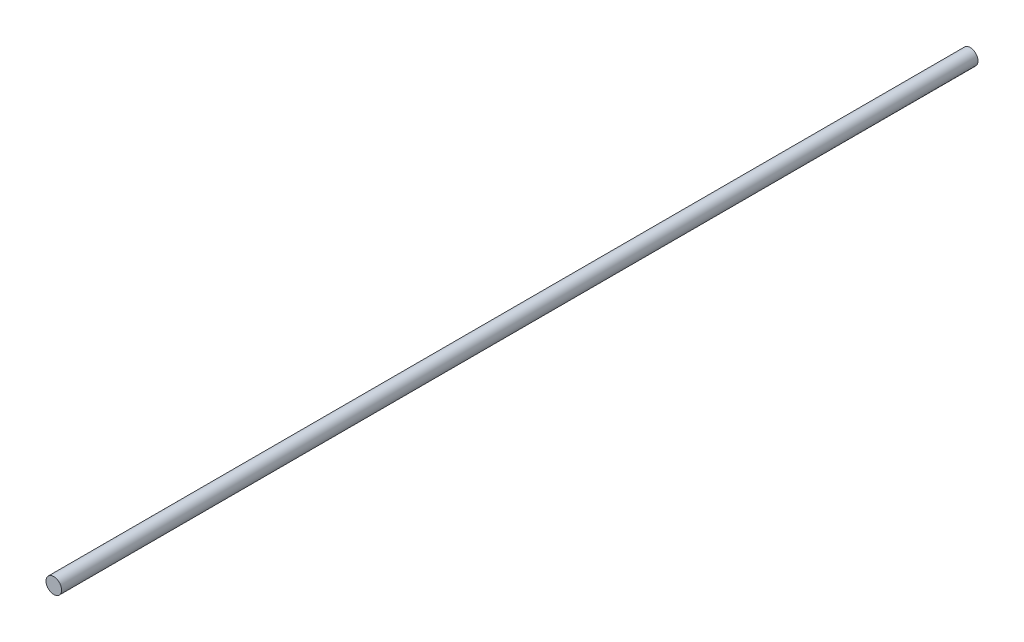
ISO-10303-21;
HEADER;
FILE_DESCRIPTION(('STEP AP214'),'2;1');
FILE_NAME('part.step','',(''),(''),'','','');
FILE_SCHEMA(('AUTOMOTIVE_DESIGN { 1 0 10303 214 1 1 1 1 }'));
ENDSEC;
DATA;
#1=APPLICATION_CONTEXT('core data for automotive mechanical design processes');
#2=APPLICATION_PROTOCOL_DEFINITION('international standard','automotive_design',2000,#1);
#3=PRODUCT_CONTEXT('',#1,'mechanical');
#4=PRODUCT('Part','Part','',(#3));
#5=PRODUCT_RELATED_PRODUCT_CATEGORY('part','',(#4));
#6=PRODUCT_DEFINITION_FORMATION('','',#4);
#7=PRODUCT_DEFINITION_CONTEXT('part definition',#1,'design');
#8=PRODUCT_DEFINITION('design','',#6,#7);
#9=PRODUCT_DEFINITION_SHAPE('','',#8);
#10=(LENGTH_UNIT() NAMED_UNIT(*) SI_UNIT(.MILLI.,.METRE.));
#11=(NAMED_UNIT(*) PLANE_ANGLE_UNIT() SI_UNIT($,.RADIAN.));
#12=(NAMED_UNIT(*) SI_UNIT($,.STERADIAN.) SOLID_ANGLE_UNIT());
#13=UNCERTAINTY_MEASURE_WITH_UNIT(LENGTH_MEASURE(1.E-05),#10,'distance_accuracy_value','');
#14=(GEOMETRIC_REPRESENTATION_CONTEXT(3) GLOBAL_UNCERTAINTY_ASSIGNED_CONTEXT((#13)) GLOBAL_UNIT_ASSIGNED_CONTEXT((#10,
#11,#12)) REPRESENTATION_CONTEXT('',''));
#15=CARTESIAN_POINT('',(0.,0.,0.));
#16=DIRECTION('',(0.,0.,1.));
#17=DIRECTION('',(1.,0.,0.));
#18=AXIS2_PLACEMENT_3D('',#15,#16,#17);
#19=CARTESIAN_POINT('',(0.,0.,293.82));
#20=DIRECTION('',(0.,0.,-1.));
#21=DIRECTION('',(-1.,0.,0.));
#22=AXIS2_PLACEMENT_3D('',#19,#20,#21);
#23=CYLINDRICAL_SURFACE('',#22,2.5);
#24=CARTESIAN_POINT('',(0.,0.,293.82));
#25=DIRECTION('',(0.,0.,1.));
#26=DIRECTION('',(1.,0.,0.));
#27=AXIS2_PLACEMENT_3D('',#24,#25,#26);
#28=CIRCLE('',#27,2.5);
#29=CARTESIAN_POINT('',(2.5,0.,293.82));
#30=VERTEX_POINT('',#29);
#31=EDGE_CURVE('E10',#30,#30,#28,.T.);
#32=ORIENTED_EDGE('',*,*,#31,.F.);
#33=EDGE_LOOP('',(#32));
#34=FACE_BOUND('',#33,.T.);
#35=CARTESIAN_POINT('',(0.,0.,0.));
#36=DIRECTION('',(0.,0.,1.));
#37=DIRECTION('',(1.,0.,0.));
#38=AXIS2_PLACEMENT_3D('',#35,#36,#37);
#39=CIRCLE('',#38,2.5);
#40=CARTESIAN_POINT('',(2.5,0.,0.));
#41=VERTEX_POINT('',#40);
#42=EDGE_CURVE('E34',#41,#41,#39,.T.);
#43=ORIENTED_EDGE('',*,*,#42,.T.);
#44=EDGE_LOOP('',(#43));
#45=FACE_BOUND('',#44,.T.);
#46=ADVANCED_FACE('F31',(#34,#45),#23,.T.);
#47=CARTESIAN_POINT('',(0.,0.,293.82));
#48=DIRECTION('',(0.,0.,1.));
#49=DIRECTION('',(1.,0.,0.));
#50=AXIS2_PLACEMENT_3D('',#47,#48,#49);
#51=PLANE('',#50);
#52=ORIENTED_EDGE('',*,*,#31,.T.);
#53=EDGE_LOOP('',(#52));
#54=FACE_BOUND('',#53,.T.);
#55=ADVANCED_FACE('F46',(#54),#51,.T.);
#56=CARTESIAN_POINT('',(0.,0.,0.));
#57=DIRECTION('',(0.,0.,1.));
#58=DIRECTION('',(1.,0.,0.));
#59=AXIS2_PLACEMENT_3D('',#56,#57,#58);
#60=PLANE('',#59);
#61=ORIENTED_EDGE('',*,*,#42,.F.);
#62=EDGE_LOOP('',(#61));
#63=FACE_BOUND('',#62,.T.);
#64=ADVANCED_FACE('F44',(#63),#60,.F.);
#65=CLOSED_SHELL('',(#46,#55,#64));
#66=MANIFOLD_SOLID_BREP('B2',#65);
#67=ADVANCED_BREP_SHAPE_REPRESENTATION('',(#18,#66),#14);
#68=SHAPE_DEFINITION_REPRESENTATION(#9,#67);
ENDSEC;
END-ISO-10303-21;
